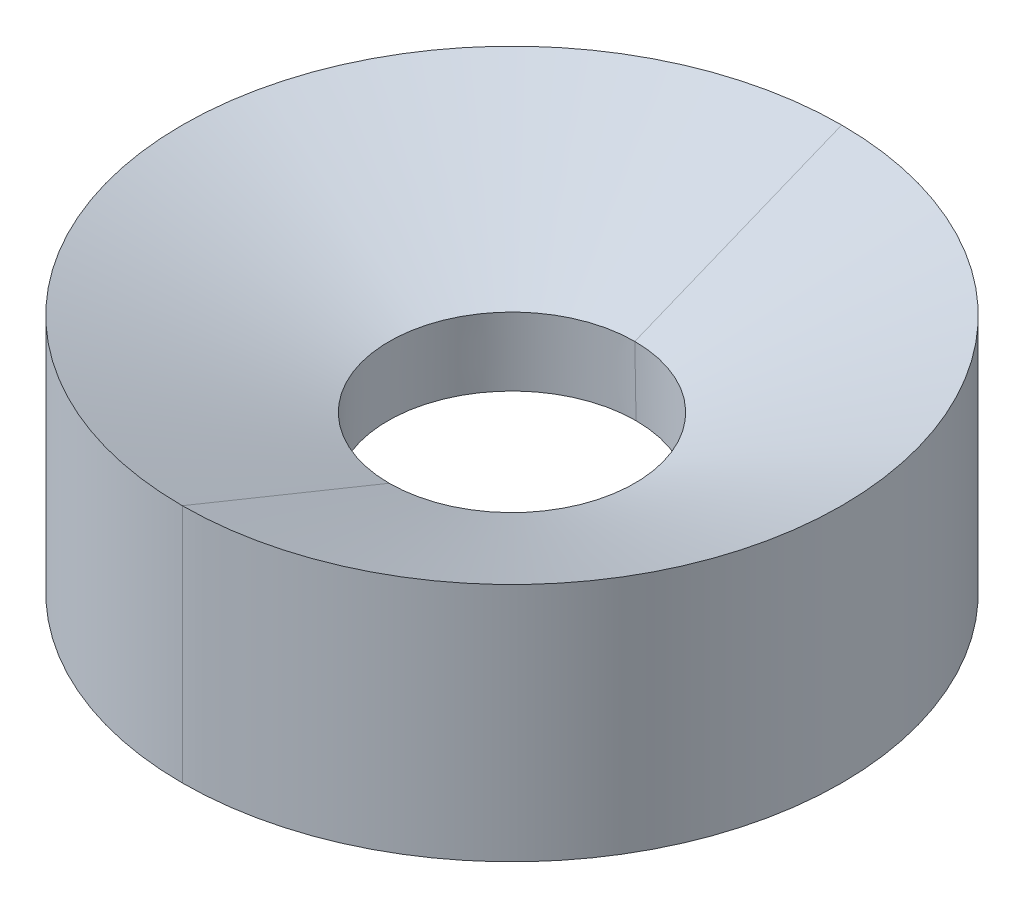
ISO-10303-21;
HEADER;
FILE_DESCRIPTION(('STEP AP214'),'2;1');
FILE_NAME('part.step','',(''),(''),'','','');
FILE_SCHEMA(('AUTOMOTIVE_DESIGN { 1 0 10303 214 1 1 1 1 }'));
ENDSEC;
DATA;
#1=APPLICATION_CONTEXT('core data for automotive mechanical design processes');
#2=APPLICATION_PROTOCOL_DEFINITION('international standard','automotive_design',2000,#1);
#3=PRODUCT_CONTEXT('',#1,'mechanical');
#4=PRODUCT('Part','Part','',(#3));
#5=PRODUCT_RELATED_PRODUCT_CATEGORY('part','',(#4));
#6=PRODUCT_DEFINITION_FORMATION('','',#4);
#7=PRODUCT_DEFINITION_CONTEXT('part definition',#1,'design');
#8=PRODUCT_DEFINITION('design','',#6,#7);
#9=PRODUCT_DEFINITION_SHAPE('','',#8);
#10=(LENGTH_UNIT() NAMED_UNIT(*) SI_UNIT(.MILLI.,.METRE.));
#11=(NAMED_UNIT(*) PLANE_ANGLE_UNIT() SI_UNIT($,.RADIAN.));
#12=(NAMED_UNIT(*) SI_UNIT($,.STERADIAN.) SOLID_ANGLE_UNIT());
#13=UNCERTAINTY_MEASURE_WITH_UNIT(LENGTH_MEASURE(1.E-05),#10,'distance_accuracy_value','');
#14=(GEOMETRIC_REPRESENTATION_CONTEXT(3) GLOBAL_UNCERTAINTY_ASSIGNED_CONTEXT((#13)) GLOBAL_UNIT_ASSIGNED_CONTEXT((#10,
#11,#12)) REPRESENTATION_CONTEXT('',''));
#15=CARTESIAN_POINT('',(0.,0.,0.));
#16=DIRECTION('',(0.,0.,1.));
#17=DIRECTION('',(1.,0.,0.));
#18=AXIS2_PLACEMENT_3D('',#15,#16,#17);
#19=CARTESIAN_POINT('',(0.,72.0902994582401,0.));
#20=DIRECTION('',(0.,1.,0.));
#21=DIRECTION('',(0.,0.,1.));
#22=AXIS2_PLACEMENT_3D('',#19,#20,#21);
#23=CONICAL_SURFACE('',#22,99.9999999999942,1.18517235533562);
#24=DIRECTION('',(0.,0.376137359370303,-0.926563914085766));
#25=VECTOR('',#24,1.);
#26=CARTESIAN_POINT('',(0.,72.0902994582401,-99.9999999999942));
#27=LINE('',#26,#25);
#28=CARTESIAN_POINT('',(0.,46.6191130302966,-37.25515));
#29=VERTEX_POINT('',#28);
#30=CARTESIAN_POINT('',(0.,72.0902994582401,-99.9999999999942));
#31=VERTEX_POINT('',#30);
#32=EDGE_CURVE('E79',#29,#31,#27,.T.);
#33=ORIENTED_EDGE('',*,*,#32,.F.);
#34=CARTESIAN_POINT('',(0.,46.6191130302966,0.));
#35=DIRECTION('',(0.,-1.,0.));
#36=DIRECTION('',(0.,0.,-1.));
#37=AXIS2_PLACEMENT_3D('',#34,#35,#36);
#38=CIRCLE('',#37,37.25515);
#39=CARTESIAN_POINT('',(0.,46.6191130302966,37.25515));
#40=VERTEX_POINT('',#39);
#41=EDGE_CURVE('E26',#29,#40,#38,.T.);
#42=ORIENTED_EDGE('',*,*,#41,.T.);
#43=DIRECTION('',(0.,0.376137359370303,0.926563914085766));
#44=VECTOR('',#43,1.);
#45=CARTESIAN_POINT('',(0.,72.0902994582401,99.9999999999942));
#46=LINE('',#45,#44);
#47=CARTESIAN_POINT('',(0.,72.0902994582401,99.9999999999942));
#48=VERTEX_POINT('',#47);
#49=EDGE_CURVE('E82',#40,#48,#46,.T.);
#50=ORIENTED_EDGE('',*,*,#49,.T.);
#51=CARTESIAN_POINT('',(0.,72.0902994582401,0.));
#52=DIRECTION('',(0.,-1.,0.));
#53=DIRECTION('',(0.,0.,-1.));
#54=AXIS2_PLACEMENT_3D('',#51,#52,#53);
#55=CIRCLE('',#54,99.9999999999942);
#56=EDGE_CURVE('E67',#31,#48,#55,.T.);
#57=ORIENTED_EDGE('',*,*,#56,.F.);
#58=EDGE_LOOP('',(#33,#42,#50,#57));
#59=FACE_BOUND('',#58,.T.);
#60=ADVANCED_FACE('F15',(#59),#23,.F.);
#61=CARTESIAN_POINT('',(0.,0.,0.));
#62=DIRECTION('',(0.,-1.,0.));
#63=DIRECTION('',(0.,0.,-1.));
#64=AXIS2_PLACEMENT_3D('',#61,#62,#63);
#65=CYLINDRICAL_SURFACE('',#64,99.9999999999942);
#66=DIRECTION('',(0.,-1.,0.));
#67=VECTOR('',#66,1.);
#68=CARTESIAN_POINT('',(0.,0.,99.9999999999942));
#69=LINE('',#68,#67);
#70=CARTESIAN_POINT('',(0.,-0.745142623663008,99.9999999999942));
#71=VERTEX_POINT('',#70);
#72=EDGE_CURVE('E85',#48,#71,#69,.T.);
#73=ORIENTED_EDGE('',*,*,#72,.F.);
#74=CARTESIAN_POINT('',(0.,72.0902994582401,0.));
#75=DIRECTION('',(0.,-1.,0.));
#76=DIRECTION('',(0.,0.,-1.));
#77=AXIS2_PLACEMENT_3D('',#74,#75,#76);
#78=CIRCLE('',#77,99.9999999999942);
#79=EDGE_CURVE('E87',#48,#31,#78,.T.);
#80=ORIENTED_EDGE('',*,*,#79,.T.);
#81=DIRECTION('',(0.,-1.,0.));
#82=VECTOR('',#81,1.);
#83=CARTESIAN_POINT('',(0.,0.,-99.9999999999942));
#84=LINE('',#83,#82);
#85=CARTESIAN_POINT('',(0.,-0.745142623663008,-99.9999999999942));
#86=VERTEX_POINT('',#85);
#87=EDGE_CURVE('E19',#31,#86,#84,.T.);
#88=ORIENTED_EDGE('',*,*,#87,.T.);
#89=CARTESIAN_POINT('',(0.,-0.745142623663008,0.));
#90=DIRECTION('',(0.,-1.,0.));
#91=DIRECTION('',(0.,0.,-1.));
#92=AXIS2_PLACEMENT_3D('',#89,#90,#91);
#93=CIRCLE('',#92,99.9999999999942);
#94=EDGE_CURVE('E115',#71,#86,#93,.T.);
#95=ORIENTED_EDGE('',*,*,#94,.F.);
#96=EDGE_LOOP('',(#73,#80,#88,#95));
#97=FACE_BOUND('',#96,.T.);
#98=ADVANCED_FACE('F88',(#97),#65,.T.);
#99=CARTESIAN_POINT('',(0.,25.6113176478002,0.));
#100=DIRECTION('',(0.,-1.,0.));
#101=DIRECTION('',(0.,0.,-1.));
#102=AXIS2_PLACEMENT_3D('',#99,#100,#101);
#103=CONICAL_SURFACE('',#102,37.6218424324,1.17102213485673);
#104=DIRECTION('',(0.,-0.389210349384455,0.921148904321137));
#105=VECTOR('',#104,1.);
#106=CARTESIAN_POINT('',(0.,25.6113176478002,37.6218424324));
#107=LINE('',#106,#105);
#108=CARTESIAN_POINT('',(0.,25.6113176478002,37.6218424324));
#109=VERTEX_POINT('',#108);
#110=EDGE_CURVE('E111',#109,#71,#107,.T.);
#111=ORIENTED_EDGE('',*,*,#110,.F.);
#112=CARTESIAN_POINT('',(0.,25.6113176478002,0.));
#113=DIRECTION('',(0.,-1.,0.));
#114=DIRECTION('',(0.,0.,-1.));
#115=AXIS2_PLACEMENT_3D('',#112,#113,#114);
#116=CIRCLE('',#115,37.6218424324);
#117=CARTESIAN_POINT('',(0.,25.6113176478002,-37.6218424324));
#118=VERTEX_POINT('',#117);
#119=EDGE_CURVE('E10',#118,#109,#116,.T.);
#120=ORIENTED_EDGE('',*,*,#119,.F.);
#121=DIRECTION('',(0.,-0.389210349384455,-0.921148904321137));
#122=VECTOR('',#121,1.);
#123=CARTESIAN_POINT('',(0.,25.6113176478002,-37.6218424324));
#124=LINE('',#123,#122);
#125=EDGE_CURVE('E112',#118,#86,#124,.T.);
#126=ORIENTED_EDGE('',*,*,#125,.T.);
#127=CARTESIAN_POINT('',(0.,-0.745142623663008,0.));
#128=DIRECTION('',(0.,-1.,0.));
#129=DIRECTION('',(0.,0.,-1.));
#130=AXIS2_PLACEMENT_3D('',#127,#128,#129);
#131=CIRCLE('',#130,99.9999999999942);
#132=EDGE_CURVE('E70',#86,#71,#131,.T.);
#133=ORIENTED_EDGE('',*,*,#132,.T.);
#134=EDGE_LOOP('',(#111,#120,#126,#133));
#135=FACE_BOUND('',#134,.T.);
#136=ADVANCED_FACE('F148',(#135),#103,.F.);
#137=CARTESIAN_POINT('',(0.,46.6191130302966,0.));
#138=DIRECTION('',(0.,-1.,0.));
#139=DIRECTION('',(0.,0.,-1.));
#140=AXIS2_PLACEMENT_3D('',#137,#138,#139);
#141=CONICAL_SURFACE('',#140,37.25515,0.0174532925199352);
#142=DIRECTION('',(0.,-0.999847695156391,0.0174524064372755));
#143=VECTOR('',#142,1.);
#144=CARTESIAN_POINT('',(0.,46.6191130302966,37.25515));
#145=LINE('',#144,#143);
#146=EDGE_CURVE('E114',#40,#109,#145,.T.);
#147=ORIENTED_EDGE('',*,*,#146,.F.);
#148=ORIENTED_EDGE('',*,*,#41,.F.);
#149=DIRECTION('',(0.,-0.999847695156391,-0.0174524064372755));
#150=VECTOR('',#149,1.);
#151=CARTESIAN_POINT('',(0.,46.6191130302966,-37.25515));
#152=LINE('',#151,#150);
#153=EDGE_CURVE('E123',#29,#118,#152,.T.);
#154=ORIENTED_EDGE('',*,*,#153,.T.);
#155=ORIENTED_EDGE('',*,*,#119,.T.);
#156=EDGE_LOOP('',(#147,#148,#154,#155));
#157=FACE_BOUND('',#156,.T.);
#158=ADVANCED_FACE('F143',(#157),#141,.F.);
#159=CARTESIAN_POINT('',(0.,46.6191130302966,0.));
#160=DIRECTION('',(0.,-1.,0.));
#161=DIRECTION('',(0.,0.,-1.));
#162=AXIS2_PLACEMENT_3D('',#159,#160,#161);
#163=CONICAL_SURFACE('',#162,37.25515,0.0174532925199352);
#164=CARTESIAN_POINT('',(0.,46.6191130302966,0.));
#165=DIRECTION('',(0.,-1.,0.));
#166=DIRECTION('',(0.,0.,-1.));
#167=AXIS2_PLACEMENT_3D('',#164,#165,#166);
#168=CIRCLE('',#167,37.25515);
#169=EDGE_CURVE('E94',#40,#29,#168,.T.);
#170=ORIENTED_EDGE('',*,*,#169,.F.);
#171=ORIENTED_EDGE('',*,*,#146,.T.);
#172=CARTESIAN_POINT('',(0.,25.6113176478002,0.));
#173=DIRECTION('',(0.,-1.,0.));
#174=DIRECTION('',(0.,0.,-1.));
#175=AXIS2_PLACEMENT_3D('',#172,#173,#174);
#176=CIRCLE('',#175,37.6218424324);
#177=EDGE_CURVE('E75',#109,#118,#176,.T.);
#178=ORIENTED_EDGE('',*,*,#177,.T.);
#179=ORIENTED_EDGE('',*,*,#153,.F.);
#180=EDGE_LOOP('',(#170,#171,#178,#179));
#181=FACE_BOUND('',#180,.T.);
#182=ADVANCED_FACE('F145',(#181),#163,.F.);
#183=CARTESIAN_POINT('',(0.,25.6113176478002,0.));
#184=DIRECTION('',(0.,-1.,0.));
#185=DIRECTION('',(0.,0.,-1.));
#186=AXIS2_PLACEMENT_3D('',#183,#184,#185);
#187=CONICAL_SURFACE('',#186,37.6218424324,1.17102213485673);
#188=ORIENTED_EDGE('',*,*,#177,.F.);
#189=ORIENTED_EDGE('',*,*,#110,.T.);
#190=ORIENTED_EDGE('',*,*,#94,.T.);
#191=ORIENTED_EDGE('',*,*,#125,.F.);
#192=EDGE_LOOP('',(#188,#189,#190,#191));
#193=FACE_BOUND('',#192,.T.);
#194=ADVANCED_FACE('F147',(#193),#187,.F.);
#195=CARTESIAN_POINT('',(0.,0.,0.));
#196=DIRECTION('',(0.,-1.,0.));
#197=DIRECTION('',(0.,0.,-1.));
#198=AXIS2_PLACEMENT_3D('',#195,#196,#197);
#199=CYLINDRICAL_SURFACE('',#198,99.9999999999942);
#200=ORIENTED_EDGE('',*,*,#56,.T.);
#201=ORIENTED_EDGE('',*,*,#72,.T.);
#202=ORIENTED_EDGE('',*,*,#132,.F.);
#203=ORIENTED_EDGE('',*,*,#87,.F.);
#204=EDGE_LOOP('',(#200,#201,#202,#203));
#205=FACE_BOUND('',#204,.T.);
#206=ADVANCED_FACE('F17',(#205),#199,.T.);
#207=CARTESIAN_POINT('',(0.,72.0902994582401,0.));
#208=DIRECTION('',(0.,1.,0.));
#209=DIRECTION('',(0.,0.,1.));
#210=AXIS2_PLACEMENT_3D('',#207,#208,#209);
#211=CONICAL_SURFACE('',#210,99.9999999999942,1.18517235533562);
#212=ORIENTED_EDGE('',*,*,#169,.T.);
#213=ORIENTED_EDGE('',*,*,#32,.T.);
#214=ORIENTED_EDGE('',*,*,#79,.F.);
#215=ORIENTED_EDGE('',*,*,#49,.F.);
#216=EDGE_LOOP('',(#212,#213,#214,#215));
#217=FACE_BOUND('',#216,.T.);
#218=ADVANCED_FACE('F92',(#217),#211,.F.);
#219=CLOSED_SHELL('',(#60,#98,#136,#158,#182,#194,#206,#218));
#220=MANIFOLD_SOLID_BREP('B1',#219);
#221=ADVANCED_BREP_SHAPE_REPRESENTATION('',(#18,#220),#14);
#222=SHAPE_DEFINITION_REPRESENTATION(#9,#221);
ENDSEC;
END-ISO-10303-21;
